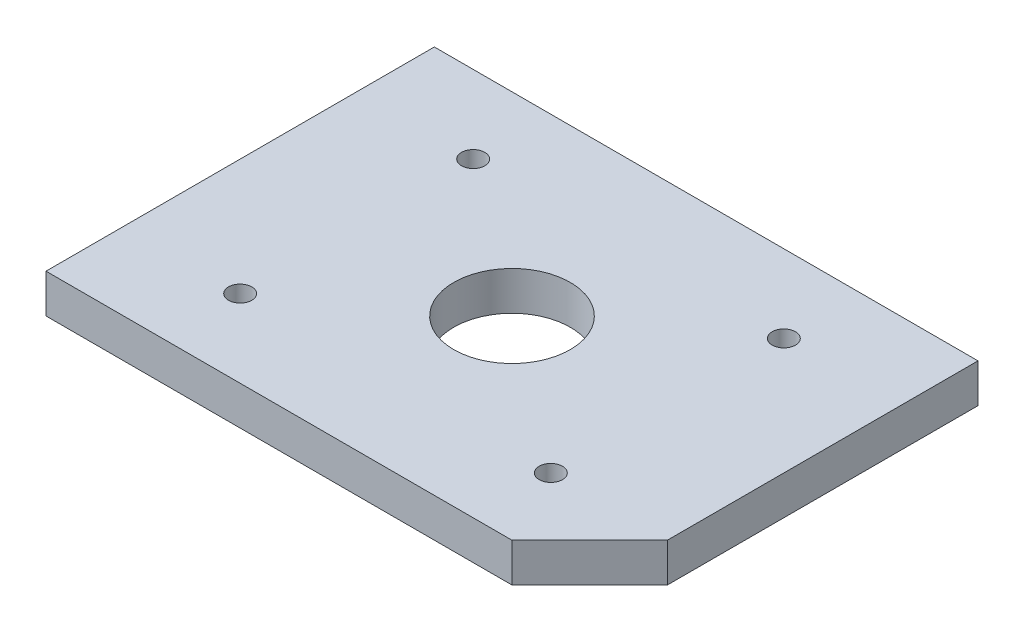
ISO-10303-21;
HEADER;
FILE_DESCRIPTION(('STEP AP214'),'2;1');
FILE_NAME('part.step','',(''),(''),'','','');
FILE_SCHEMA(('AUTOMOTIVE_DESIGN { 1 0 10303 214 1 1 1 1 }'));
ENDSEC;
DATA;
#1=APPLICATION_CONTEXT('core data for automotive mechanical design processes');
#2=APPLICATION_PROTOCOL_DEFINITION('international standard','automotive_design',2000,#1);
#3=PRODUCT_CONTEXT('',#1,'mechanical');
#4=PRODUCT('Part','Part','',(#3));
#5=PRODUCT_RELATED_PRODUCT_CATEGORY('part','',(#4));
#6=PRODUCT_DEFINITION_FORMATION('','',#4);
#7=PRODUCT_DEFINITION_CONTEXT('part definition',#1,'design');
#8=PRODUCT_DEFINITION('design','',#6,#7);
#9=PRODUCT_DEFINITION_SHAPE('','',#8);
#10=(LENGTH_UNIT() NAMED_UNIT(*) SI_UNIT(.MILLI.,.METRE.));
#11=(NAMED_UNIT(*) PLANE_ANGLE_UNIT() SI_UNIT($,.RADIAN.));
#12=(NAMED_UNIT(*) SI_UNIT($,.STERADIAN.) SOLID_ANGLE_UNIT());
#13=UNCERTAINTY_MEASURE_WITH_UNIT(LENGTH_MEASURE(1.E-05),#10,'distance_accuracy_value','');
#14=(GEOMETRIC_REPRESENTATION_CONTEXT(3) GLOBAL_UNCERTAINTY_ASSIGNED_CONTEXT((#13)) GLOBAL_UNIT_ASSIGNED_CONTEXT((#10,
#11,#12)) REPRESENTATION_CONTEXT('',''));
#15=CARTESIAN_POINT('',(0.,0.,0.));
#16=DIRECTION('',(0.,0.,1.));
#17=DIRECTION('',(1.,0.,0.));
#18=AXIS2_PLACEMENT_3D('',#15,#16,#17);
#19=CARTESIAN_POINT('',(25.,5.,25.));
#20=DIRECTION('',(-0.707106781186548,0.,-0.707106781186548));
#21=DIRECTION('',(-0.707106781186548,0.,0.707106781186548));
#22=AXIS2_PLACEMENT_3D('',#19,#20,#21);
#23=PLANE('',#22);
#24=DIRECTION('',(0.707106781186548,0.,-0.707106781186548));
#25=VECTOR('',#24,1.);
#26=CARTESIAN_POINT('',(25.,0.,25.));
#27=LINE('',#26,#25);
#28=CARTESIAN_POINT('',(25.,0.,25.));
#29=VERTEX_POINT('',#28);
#30=CARTESIAN_POINT('',(35.,0.,15.));
#31=VERTEX_POINT('',#30);
#32=EDGE_CURVE('E123',#29,#31,#27,.T.);
#33=ORIENTED_EDGE('',*,*,#32,.T.);
#34=DIRECTION('',(0.,-1.,0.));
#35=VECTOR('',#34,1.);
#36=CARTESIAN_POINT('',(35.,5.,15.));
#37=LINE('',#36,#35);
#38=CARTESIAN_POINT('',(35.,5.,15.));
#39=VERTEX_POINT('',#38);
#40=EDGE_CURVE('E11',#39,#31,#37,.T.);
#41=ORIENTED_EDGE('',*,*,#40,.F.);
#42=DIRECTION('',(0.707106781186548,0.,-0.707106781186548));
#43=VECTOR('',#42,1.);
#44=CARTESIAN_POINT('',(25.,5.,25.));
#45=LINE('',#44,#43);
#46=CARTESIAN_POINT('',(25.,5.,25.));
#47=VERTEX_POINT('',#46);
#48=EDGE_CURVE('E142',#47,#39,#45,.T.);
#49=ORIENTED_EDGE('',*,*,#48,.F.);
#50=DIRECTION('',(0.,-1.,0.));
#51=VECTOR('',#50,1.);
#52=CARTESIAN_POINT('',(25.,5.,25.));
#53=LINE('',#52,#51);
#54=EDGE_CURVE('E104',#47,#29,#53,.T.);
#55=ORIENTED_EDGE('',*,*,#54,.T.);
#56=EDGE_LOOP('',(#33,#41,#49,#55));
#57=FACE_BOUND('',#56,.T.);
#58=ADVANCED_FACE('F35',(#57),#23,.F.);
#59=CARTESIAN_POINT('',(35.,5.,0.));
#60=DIRECTION('',(-1.,0.,0.));
#61=DIRECTION('',(0.,0.,1.));
#62=AXIS2_PLACEMENT_3D('',#59,#60,#61);
#63=PLANE('',#62);
#64=DIRECTION('',(0.,0.,-1.));
#65=VECTOR('',#64,1.);
#66=CARTESIAN_POINT('',(35.,0.,0.));
#67=LINE('',#66,#65);
#68=CARTESIAN_POINT('',(35.,0.,-25.));
#69=VERTEX_POINT('',#68);
#70=EDGE_CURVE('E126',#31,#69,#67,.T.);
#71=ORIENTED_EDGE('',*,*,#70,.T.);
#72=DIRECTION('',(0.,-1.,0.));
#73=VECTOR('',#72,1.);
#74=CARTESIAN_POINT('',(35.,5.,-25.));
#75=LINE('',#74,#73);
#76=CARTESIAN_POINT('',(35.,5.,-25.));
#77=VERTEX_POINT('',#76);
#78=EDGE_CURVE('E44',#77,#69,#75,.T.);
#79=ORIENTED_EDGE('',*,*,#78,.F.);
#80=DIRECTION('',(0.,0.,-1.));
#81=VECTOR('',#80,1.);
#82=CARTESIAN_POINT('',(35.,5.,0.));
#83=LINE('',#82,#81);
#84=EDGE_CURVE('E82',#39,#77,#83,.T.);
#85=ORIENTED_EDGE('',*,*,#84,.F.);
#86=ORIENTED_EDGE('',*,*,#40,.T.);
#87=EDGE_LOOP('',(#71,#79,#85,#86));
#88=FACE_BOUND('',#87,.T.);
#89=ADVANCED_FACE('F135',(#88),#63,.F.);
#90=CARTESIAN_POINT('',(0.,5.,-25.));
#91=DIRECTION('',(0.,0.,-1.));
#92=DIRECTION('',(-1.,0.,0.));
#93=AXIS2_PLACEMENT_3D('',#90,#91,#92);
#94=PLANE('',#93);
#95=DIRECTION('',(1.,0.,0.));
#96=VECTOR('',#95,1.);
#97=CARTESIAN_POINT('',(0.,0.,-25.));
#98=LINE('',#97,#96);
#99=CARTESIAN_POINT('',(-35.,0.,-25.));
#100=VERTEX_POINT('',#99);
#101=EDGE_CURVE('E93',#100,#69,#98,.T.);
#102=ORIENTED_EDGE('',*,*,#101,.F.);
#103=DIRECTION('',(0.,-1.,0.));
#104=VECTOR('',#103,1.);
#105=CARTESIAN_POINT('',(-35.,5.,-25.));
#106=LINE('',#105,#104);
#107=CARTESIAN_POINT('',(-35.,5.,-25.));
#108=VERTEX_POINT('',#107);
#109=EDGE_CURVE('E88',#108,#100,#106,.T.);
#110=ORIENTED_EDGE('',*,*,#109,.F.);
#111=DIRECTION('',(1.,0.,0.));
#112=VECTOR('',#111,1.);
#113=CARTESIAN_POINT('',(0.,5.,-25.));
#114=LINE('',#113,#112);
#115=EDGE_CURVE('E91',#108,#77,#114,.T.);
#116=ORIENTED_EDGE('',*,*,#115,.T.);
#117=ORIENTED_EDGE('',*,*,#78,.T.);
#118=EDGE_LOOP('',(#102,#110,#116,#117));
#119=FACE_BOUND('',#118,.T.);
#120=ADVANCED_FACE('F90',(#119),#94,.T.);
#121=CARTESIAN_POINT('',(-35.,5.,0.));
#122=DIRECTION('',(-1.,0.,0.));
#123=DIRECTION('',(0.,0.,1.));
#124=AXIS2_PLACEMENT_3D('',#121,#122,#123);
#125=PLANE('',#124);
#126=DIRECTION('',(0.,0.,-1.));
#127=VECTOR('',#126,1.);
#128=CARTESIAN_POINT('',(-35.,0.,0.));
#129=LINE('',#128,#127);
#130=CARTESIAN_POINT('',(-35.,0.,25.));
#131=VERTEX_POINT('',#130);
#132=EDGE_CURVE('E130',#131,#100,#129,.T.);
#133=ORIENTED_EDGE('',*,*,#132,.F.);
#134=DIRECTION('',(0.,-1.,0.));
#135=VECTOR('',#134,1.);
#136=CARTESIAN_POINT('',(-35.,5.,25.));
#137=LINE('',#136,#135);
#138=CARTESIAN_POINT('',(-35.,5.,25.));
#139=VERTEX_POINT('',#138);
#140=EDGE_CURVE('E71',#139,#131,#137,.T.);
#141=ORIENTED_EDGE('',*,*,#140,.F.);
#142=DIRECTION('',(0.,0.,-1.));
#143=VECTOR('',#142,1.);
#144=CARTESIAN_POINT('',(-35.,5.,0.));
#145=LINE('',#144,#143);
#146=EDGE_CURVE('E100',#139,#108,#145,.T.);
#147=ORIENTED_EDGE('',*,*,#146,.T.);
#148=ORIENTED_EDGE('',*,*,#109,.T.);
#149=EDGE_LOOP('',(#133,#141,#147,#148));
#150=FACE_BOUND('',#149,.T.);
#151=ADVANCED_FACE('F102',(#150),#125,.T.);
#152=CARTESIAN_POINT('',(0.,5.,0.));
#153=DIRECTION('',(0.,-1.,0.));
#154=DIRECTION('',(0.,0.,-1.));
#155=AXIS2_PLACEMENT_3D('',#152,#153,#154);
#156=CYLINDRICAL_SURFACE('',#155,7.5);
#157=CARTESIAN_POINT('',(0.,5.,0.));
#158=DIRECTION('',(0.,1.,0.));
#159=DIRECTION('',(0.,0.,1.));
#160=AXIS2_PLACEMENT_3D('',#157,#158,#159);
#161=CIRCLE('',#160,7.5);
#162=CARTESIAN_POINT('',(0.,5.,7.5));
#163=VERTEX_POINT('',#162);
#164=EDGE_CURVE('E277',#163,#163,#161,.T.);
#165=ORIENTED_EDGE('',*,*,#164,.T.);
#166=EDGE_LOOP('',(#165));
#167=FACE_BOUND('',#166,.T.);
#168=CARTESIAN_POINT('',(0.,0.,0.));
#169=DIRECTION('',(0.,1.,0.));
#170=DIRECTION('',(0.,0.,1.));
#171=AXIS2_PLACEMENT_3D('',#168,#169,#170);
#172=CIRCLE('',#171,7.5);
#173=CARTESIAN_POINT('',(0.,0.,7.5));
#174=VERTEX_POINT('',#173);
#175=EDGE_CURVE('E120',#174,#174,#172,.T.);
#176=ORIENTED_EDGE('',*,*,#175,.F.);
#177=EDGE_LOOP('',(#176));
#178=FACE_BOUND('',#177,.T.);
#179=ADVANCED_FACE('F164',(#167,#178),#156,.F.);
#180=CARTESIAN_POINT('',(-20.,5.,-15.));
#181=DIRECTION('',(0.,-1.,0.));
#182=DIRECTION('',(0.,0.,-1.));
#183=AXIS2_PLACEMENT_3D('',#180,#181,#182);
#184=CYLINDRICAL_SURFACE('',#183,1.5);
#185=CARTESIAN_POINT('',(-20.,5.,-15.));
#186=DIRECTION('',(0.,1.,0.));
#187=DIRECTION('',(0.,0.,1.));
#188=AXIS2_PLACEMENT_3D('',#185,#186,#187);
#189=CIRCLE('',#188,1.5);
#190=CARTESIAN_POINT('',(-20.,5.,-13.5));
#191=VERTEX_POINT('',#190);
#192=EDGE_CURVE('E270',#191,#191,#189,.T.);
#193=ORIENTED_EDGE('',*,*,#192,.T.);
#194=EDGE_LOOP('',(#193));
#195=FACE_BOUND('',#194,.T.);
#196=CARTESIAN_POINT('',(-20.,0.,-15.));
#197=DIRECTION('',(0.,1.,0.));
#198=DIRECTION('',(0.,0.,1.));
#199=AXIS2_PLACEMENT_3D('',#196,#197,#198);
#200=CIRCLE('',#199,1.5);
#201=CARTESIAN_POINT('',(-20.,0.,-13.5));
#202=VERTEX_POINT('',#201);
#203=EDGE_CURVE('E117',#202,#202,#200,.T.);
#204=ORIENTED_EDGE('',*,*,#203,.F.);
#205=EDGE_LOOP('',(#204));
#206=FACE_BOUND('',#205,.T.);
#207=ADVANCED_FACE('F167',(#195,#206),#184,.F.);
#208=CARTESIAN_POINT('',(20.,5.,-15.));
#209=DIRECTION('',(0.,-1.,0.));
#210=DIRECTION('',(0.,0.,-1.));
#211=AXIS2_PLACEMENT_3D('',#208,#209,#210);
#212=CYLINDRICAL_SURFACE('',#211,1.5);
#213=CARTESIAN_POINT('',(20.,5.,-15.));
#214=DIRECTION('',(0.,1.,0.));
#215=DIRECTION('',(0.,0.,1.));
#216=AXIS2_PLACEMENT_3D('',#213,#214,#215);
#217=CIRCLE('',#216,1.5);
#218=CARTESIAN_POINT('',(20.,5.,-13.5));
#219=VERTEX_POINT('',#218);
#220=EDGE_CURVE('E267',#219,#219,#217,.T.);
#221=ORIENTED_EDGE('',*,*,#220,.T.);
#222=EDGE_LOOP('',(#221));
#223=FACE_BOUND('',#222,.T.);
#224=CARTESIAN_POINT('',(20.,0.,-15.));
#225=DIRECTION('',(0.,1.,0.));
#226=DIRECTION('',(0.,0.,1.));
#227=AXIS2_PLACEMENT_3D('',#224,#225,#226);
#228=CIRCLE('',#227,1.5);
#229=CARTESIAN_POINT('',(20.,0.,-13.5));
#230=VERTEX_POINT('',#229);
#231=EDGE_CURVE('E114',#230,#230,#228,.T.);
#232=ORIENTED_EDGE('',*,*,#231,.F.);
#233=EDGE_LOOP('',(#232));
#234=FACE_BOUND('',#233,.T.);
#235=ADVANCED_FACE('F171',(#223,#234),#212,.F.);
#236=CARTESIAN_POINT('',(20.,5.,15.));
#237=DIRECTION('',(0.,-1.,0.));
#238=DIRECTION('',(0.,0.,-1.));
#239=AXIS2_PLACEMENT_3D('',#236,#237,#238);
#240=CYLINDRICAL_SURFACE('',#239,1.5);
#241=CARTESIAN_POINT('',(20.,5.,15.));
#242=DIRECTION('',(0.,1.,0.));
#243=DIRECTION('',(0.,0.,1.));
#244=AXIS2_PLACEMENT_3D('',#241,#242,#243);
#245=CIRCLE('',#244,1.5);
#246=CARTESIAN_POINT('',(20.,5.,16.5));
#247=VERTEX_POINT('',#246);
#248=EDGE_CURVE('E182',#247,#247,#245,.T.);
#249=ORIENTED_EDGE('',*,*,#248,.T.);
#250=EDGE_LOOP('',(#249));
#251=FACE_BOUND('',#250,.T.);
#252=CARTESIAN_POINT('',(20.,0.,15.));
#253=DIRECTION('',(0.,1.,0.));
#254=DIRECTION('',(0.,0.,1.));
#255=AXIS2_PLACEMENT_3D('',#252,#253,#254);
#256=CIRCLE('',#255,1.5);
#257=CARTESIAN_POINT('',(20.,0.,16.5));
#258=VERTEX_POINT('',#257);
#259=EDGE_CURVE('E111',#258,#258,#256,.T.);
#260=ORIENTED_EDGE('',*,*,#259,.F.);
#261=EDGE_LOOP('',(#260));
#262=FACE_BOUND('',#261,.T.);
#263=ADVANCED_FACE('F152',(#251,#262),#240,.F.);
#264=CARTESIAN_POINT('',(-20.,5.,15.));
#265=DIRECTION('',(0.,-1.,0.));
#266=DIRECTION('',(0.,0.,-1.));
#267=AXIS2_PLACEMENT_3D('',#264,#265,#266);
#268=CYLINDRICAL_SURFACE('',#267,1.5);
#269=CARTESIAN_POINT('',(-20.,5.,15.));
#270=DIRECTION('',(0.,1.,0.));
#271=DIRECTION('',(0.,0.,1.));
#272=AXIS2_PLACEMENT_3D('',#269,#270,#271);
#273=CIRCLE('',#272,1.5);
#274=CARTESIAN_POINT('',(-20.,5.,16.5));
#275=VERTEX_POINT('',#274);
#276=EDGE_CURVE('E133',#275,#275,#273,.T.);
#277=ORIENTED_EDGE('',*,*,#276,.T.);
#278=EDGE_LOOP('',(#277));
#279=FACE_BOUND('',#278,.T.);
#280=CARTESIAN_POINT('',(-20.,0.,15.));
#281=DIRECTION('',(0.,1.,0.));
#282=DIRECTION('',(0.,0.,1.));
#283=AXIS2_PLACEMENT_3D('',#280,#281,#282);
#284=CIRCLE('',#283,1.5);
#285=CARTESIAN_POINT('',(-20.,0.,16.5));
#286=VERTEX_POINT('',#285);
#287=EDGE_CURVE('E108',#286,#286,#284,.T.);
#288=ORIENTED_EDGE('',*,*,#287,.F.);
#289=EDGE_LOOP('',(#288));
#290=FACE_BOUND('',#289,.T.);
#291=ADVANCED_FACE('F37',(#279,#290),#268,.F.);
#292=CARTESIAN_POINT('',(0.,5.,25.));
#293=DIRECTION('',(0.,0.,-1.));
#294=DIRECTION('',(-1.,0.,0.));
#295=AXIS2_PLACEMENT_3D('',#292,#293,#294);
#296=PLANE('',#295);
#297=DIRECTION('',(1.,0.,0.));
#298=VECTOR('',#297,1.);
#299=CARTESIAN_POINT('',(0.,0.,25.));
#300=LINE('',#299,#298);
#301=EDGE_CURVE('E74',#131,#29,#300,.T.);
#302=ORIENTED_EDGE('',*,*,#301,.T.);
#303=ORIENTED_EDGE('',*,*,#54,.F.);
#304=DIRECTION('',(1.,0.,0.));
#305=VECTOR('',#304,1.);
#306=CARTESIAN_POINT('',(0.,5.,25.));
#307=LINE('',#306,#305);
#308=EDGE_CURVE('E52',#139,#47,#307,.T.);
#309=ORIENTED_EDGE('',*,*,#308,.F.);
#310=ORIENTED_EDGE('',*,*,#140,.T.);
#311=EDGE_LOOP('',(#302,#303,#309,#310));
#312=FACE_BOUND('',#311,.T.);
#313=ADVANCED_FACE('F143',(#312),#296,.F.);
#314=CARTESIAN_POINT('',(0.,5.,0.));
#315=DIRECTION('',(0.,1.,0.));
#316=DIRECTION('',(0.,0.,1.));
#317=AXIS2_PLACEMENT_3D('',#314,#315,#316);
#318=PLANE('',#317);
#319=ORIENTED_EDGE('',*,*,#276,.F.);
#320=EDGE_LOOP('',(#319));
#321=FACE_BOUND('',#320,.T.);
#322=ORIENTED_EDGE('',*,*,#248,.F.);
#323=EDGE_LOOP('',(#322));
#324=FACE_BOUND('',#323,.T.);
#325=ORIENTED_EDGE('',*,*,#220,.F.);
#326=EDGE_LOOP('',(#325));
#327=FACE_BOUND('',#326,.T.);
#328=ORIENTED_EDGE('',*,*,#192,.F.);
#329=EDGE_LOOP('',(#328));
#330=FACE_BOUND('',#329,.T.);
#331=ORIENTED_EDGE('',*,*,#164,.F.);
#332=EDGE_LOOP('',(#331));
#333=FACE_BOUND('',#332,.T.);
#334=ORIENTED_EDGE('',*,*,#48,.T.);
#335=ORIENTED_EDGE('',*,*,#84,.T.);
#336=ORIENTED_EDGE('',*,*,#115,.F.);
#337=ORIENTED_EDGE('',*,*,#146,.F.);
#338=ORIENTED_EDGE('',*,*,#308,.T.);
#339=EDGE_LOOP('',(#334,#335,#336,#337,#338));
#340=FACE_BOUND('',#339,.T.);
#341=ADVANCED_FACE('F99',(#321,#324,#327,#330,#333,#340),#318,.T.);
#342=CARTESIAN_POINT('',(0.,0.,0.));
#343=DIRECTION('',(0.,1.,0.));
#344=DIRECTION('',(0.,0.,1.));
#345=AXIS2_PLACEMENT_3D('',#342,#343,#344);
#346=PLANE('',#345);
#347=ORIENTED_EDGE('',*,*,#287,.T.);
#348=EDGE_LOOP('',(#347));
#349=FACE_BOUND('',#348,.T.);
#350=ORIENTED_EDGE('',*,*,#259,.T.);
#351=EDGE_LOOP('',(#350));
#352=FACE_BOUND('',#351,.T.);
#353=ORIENTED_EDGE('',*,*,#231,.T.);
#354=EDGE_LOOP('',(#353));
#355=FACE_BOUND('',#354,.T.);
#356=ORIENTED_EDGE('',*,*,#203,.T.);
#357=EDGE_LOOP('',(#356));
#358=FACE_BOUND('',#357,.T.);
#359=ORIENTED_EDGE('',*,*,#175,.T.);
#360=EDGE_LOOP('',(#359));
#361=FACE_BOUND('',#360,.T.);
#362=ORIENTED_EDGE('',*,*,#32,.F.);
#363=ORIENTED_EDGE('',*,*,#301,.F.);
#364=ORIENTED_EDGE('',*,*,#132,.T.);
#365=ORIENTED_EDGE('',*,*,#101,.T.);
#366=ORIENTED_EDGE('',*,*,#70,.F.);
#367=EDGE_LOOP('',(#362,#363,#364,#365,#366));
#368=FACE_BOUND('',#367,.T.);
#369=ADVANCED_FACE('F139',(#349,#352,#355,#358,#361,#368),#346,.F.);
#370=CLOSED_SHELL('',(#58,#89,#120,#151,#179,#207,#235,#263,#291,#313,#341,#369));
#371=MANIFOLD_SOLID_BREP('B2',#370);
#372=ADVANCED_BREP_SHAPE_REPRESENTATION('',(#18,#371),#14);
#373=SHAPE_DEFINITION_REPRESENTATION(#9,#372);
ENDSEC;
END-ISO-10303-21;
